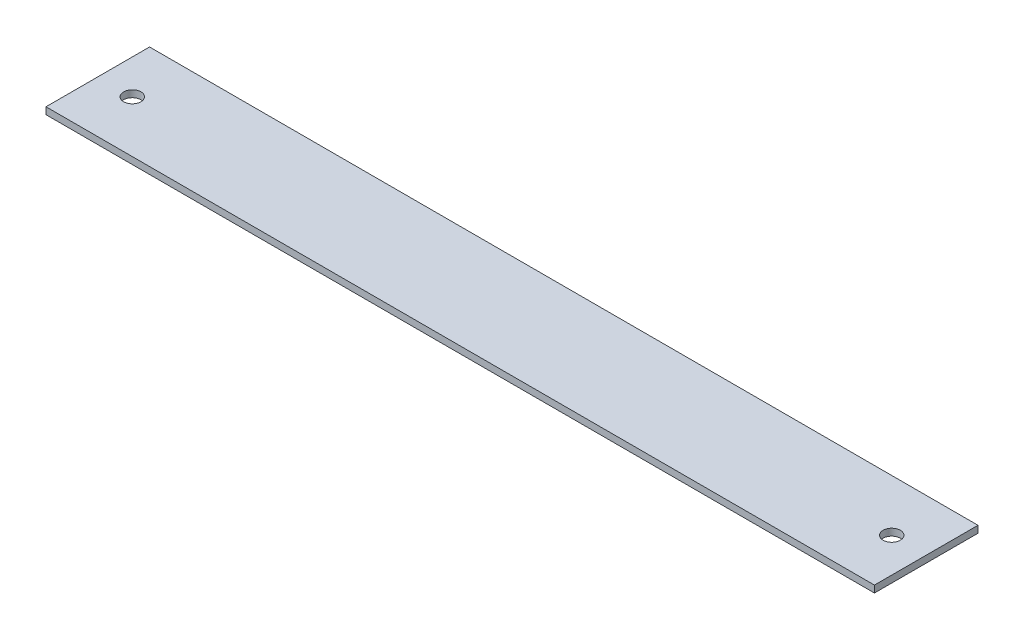
ISO-10303-21;
HEADER;
FILE_DESCRIPTION(('STEP AP214'),'2;1');
FILE_NAME('part.step','',(''),(''),'','','');
FILE_SCHEMA(('AUTOMOTIVE_DESIGN { 1 0 10303 214 1 1 1 1 }'));
ENDSEC;
DATA;
#1=APPLICATION_CONTEXT('core data for automotive mechanical design processes');
#2=APPLICATION_PROTOCOL_DEFINITION('international standard','automotive_design',2000,#1);
#3=PRODUCT_CONTEXT('',#1,'mechanical');
#4=PRODUCT('Part','Part','',(#3));
#5=PRODUCT_RELATED_PRODUCT_CATEGORY('part','',(#4));
#6=PRODUCT_DEFINITION_FORMATION('','',#4);
#7=PRODUCT_DEFINITION_CONTEXT('part definition',#1,'design');
#8=PRODUCT_DEFINITION('design','',#6,#7);
#9=PRODUCT_DEFINITION_SHAPE('','',#8);
#10=(LENGTH_UNIT() NAMED_UNIT(*) SI_UNIT(.MILLI.,.METRE.));
#11=(NAMED_UNIT(*) PLANE_ANGLE_UNIT() SI_UNIT($,.RADIAN.));
#12=(NAMED_UNIT(*) SI_UNIT($,.STERADIAN.) SOLID_ANGLE_UNIT());
#13=UNCERTAINTY_MEASURE_WITH_UNIT(LENGTH_MEASURE(1.E-05),#10,'distance_accuracy_value','');
#14=(GEOMETRIC_REPRESENTATION_CONTEXT(3) GLOBAL_UNCERTAINTY_ASSIGNED_CONTEXT((#13)) GLOBAL_UNIT_ASSIGNED_CONTEXT((#10,
#11,#12)) REPRESENTATION_CONTEXT('',''));
#15=CARTESIAN_POINT('',(0.,0.,0.));
#16=DIRECTION('',(0.,0.,1.));
#17=DIRECTION('',(1.,0.,0.));
#18=AXIS2_PLACEMENT_3D('',#15,#16,#17);
#19=CARTESIAN_POINT('',(0.,1.,0.));
#20=DIRECTION('',(1.,0.,0.));
#21=DIRECTION('',(0.,0.,-1.));
#22=AXIS2_PLACEMENT_3D('',#19,#20,#21);
#23=PLANE('',#22);
#24=DIRECTION('',(0.,0.,1.));
#25=VECTOR('',#24,1.);
#26=CARTESIAN_POINT('',(0.,0.,0.));
#27=LINE('',#26,#25);
#28=CARTESIAN_POINT('',(0.,0.,-15.));
#29=VERTEX_POINT('',#28);
#30=CARTESIAN_POINT('',(0.,0.,0.));
#31=VERTEX_POINT('',#30);
#32=EDGE_CURVE('E97',#29,#31,#27,.T.);
#33=ORIENTED_EDGE('',*,*,#32,.T.);
#34=DIRECTION('',(0.,-1.,0.));
#35=VECTOR('',#34,1.);
#36=CARTESIAN_POINT('',(0.,1.,0.));
#37=LINE('',#36,#35);
#38=CARTESIAN_POINT('',(0.,1.,0.));
#39=VERTEX_POINT('',#38);
#40=EDGE_CURVE('E11',#39,#31,#37,.T.);
#41=ORIENTED_EDGE('',*,*,#40,.F.);
#42=DIRECTION('',(0.,0.,1.));
#43=VECTOR('',#42,1.);
#44=CARTESIAN_POINT('',(0.,1.,0.));
#45=LINE('',#44,#43);
#46=CARTESIAN_POINT('',(0.,1.,-15.));
#47=VERTEX_POINT('',#46);
#48=EDGE_CURVE('E85',#47,#39,#45,.T.);
#49=ORIENTED_EDGE('',*,*,#48,.F.);
#50=DIRECTION('',(0.,-1.,0.));
#51=VECTOR('',#50,1.);
#52=CARTESIAN_POINT('',(0.,1.,-15.));
#53=LINE('',#52,#51);
#54=EDGE_CURVE('E93',#47,#29,#53,.T.);
#55=ORIENTED_EDGE('',*,*,#54,.T.);
#56=EDGE_LOOP('',(#33,#41,#49,#55));
#57=FACE_BOUND('',#56,.T.);
#58=ADVANCED_FACE('F34',(#57),#23,.F.);
#59=CARTESIAN_POINT('',(0.,1.,0.));
#60=DIRECTION('',(0.,0.,-1.));
#61=DIRECTION('',(-1.,0.,0.));
#62=AXIS2_PLACEMENT_3D('',#59,#60,#61);
#63=PLANE('',#62);
#64=DIRECTION('',(1.,0.,0.));
#65=VECTOR('',#64,1.);
#66=CARTESIAN_POINT('',(0.,0.,0.));
#67=LINE('',#66,#65);
#68=CARTESIAN_POINT('',(120.,0.,0.));
#69=VERTEX_POINT('',#68);
#70=EDGE_CURVE('E89',#31,#69,#67,.T.);
#71=ORIENTED_EDGE('',*,*,#70,.T.);
#72=DIRECTION('',(0.,-1.,0.));
#73=VECTOR('',#72,1.);
#74=CARTESIAN_POINT('',(120.,1.,0.));
#75=LINE('',#74,#73);
#76=CARTESIAN_POINT('',(120.,1.,0.));
#77=VERTEX_POINT('',#76);
#78=EDGE_CURVE('E42',#77,#69,#75,.T.);
#79=ORIENTED_EDGE('',*,*,#78,.F.);
#80=DIRECTION('',(1.,0.,0.));
#81=VECTOR('',#80,1.);
#82=CARTESIAN_POINT('',(0.,1.,0.));
#83=LINE('',#82,#81);
#84=EDGE_CURVE('E80',#39,#77,#83,.T.);
#85=ORIENTED_EDGE('',*,*,#84,.F.);
#86=ORIENTED_EDGE('',*,*,#40,.T.);
#87=EDGE_LOOP('',(#71,#79,#85,#86));
#88=FACE_BOUND('',#87,.T.);
#89=ADVANCED_FACE('F88',(#88),#63,.F.);
#90=CARTESIAN_POINT('',(120.,1.,0.));
#91=DIRECTION('',(-1.,0.,0.));
#92=DIRECTION('',(0.,0.,1.));
#93=AXIS2_PLACEMENT_3D('',#90,#91,#92);
#94=PLANE('',#93);
#95=DIRECTION('',(0.,0.,-1.));
#96=VECTOR('',#95,1.);
#97=CARTESIAN_POINT('',(120.,0.,0.));
#98=LINE('',#97,#96);
#99=CARTESIAN_POINT('',(120.,0.,-15.));
#100=VERTEX_POINT('',#99);
#101=EDGE_CURVE('E67',#69,#100,#98,.T.);
#102=ORIENTED_EDGE('',*,*,#101,.T.);
#103=DIRECTION('',(0.,-1.,0.));
#104=VECTOR('',#103,1.);
#105=CARTESIAN_POINT('',(120.,1.,-15.));
#106=LINE('',#105,#104);
#107=CARTESIAN_POINT('',(120.,1.,-15.));
#108=VERTEX_POINT('',#107);
#109=EDGE_CURVE('E90',#108,#100,#106,.T.);
#110=ORIENTED_EDGE('',*,*,#109,.F.);
#111=DIRECTION('',(0.,0.,-1.));
#112=VECTOR('',#111,1.);
#113=CARTESIAN_POINT('',(120.,1.,0.));
#114=LINE('',#113,#112);
#115=EDGE_CURVE('E83',#77,#108,#114,.T.);
#116=ORIENTED_EDGE('',*,*,#115,.F.);
#117=ORIENTED_EDGE('',*,*,#78,.T.);
#118=EDGE_LOOP('',(#102,#110,#116,#117));
#119=FACE_BOUND('',#118,.T.);
#120=ADVANCED_FACE('F91',(#119),#94,.F.);
#121=CARTESIAN_POINT('',(0.,1.,-15.));
#122=DIRECTION('',(0.,0.,1.));
#123=DIRECTION('',(1.,0.,0.));
#124=AXIS2_PLACEMENT_3D('',#121,#122,#123);
#125=PLANE('',#124);
#126=DIRECTION('',(-1.,0.,0.));
#127=VECTOR('',#126,1.);
#128=CARTESIAN_POINT('',(0.,0.,-15.));
#129=LINE('',#128,#127);
#130=EDGE_CURVE('E73',#100,#29,#129,.T.);
#131=ORIENTED_EDGE('',*,*,#130,.T.);
#132=ORIENTED_EDGE('',*,*,#54,.F.);
#133=DIRECTION('',(-1.,0.,0.));
#134=VECTOR('',#133,1.);
#135=CARTESIAN_POINT('',(0.,1.,-15.));
#136=LINE('',#135,#134);
#137=EDGE_CURVE('E50',#108,#47,#136,.T.);
#138=ORIENTED_EDGE('',*,*,#137,.F.);
#139=ORIENTED_EDGE('',*,*,#109,.T.);
#140=EDGE_LOOP('',(#131,#132,#138,#139));
#141=FACE_BOUND('',#140,.T.);
#142=ADVANCED_FACE('F105',(#141),#125,.F.);
#143=CARTESIAN_POINT('',(0.,1.,0.));
#144=DIRECTION('',(0.,-1.,0.));
#145=DIRECTION('',(0.,0.,-1.));
#146=AXIS2_PLACEMENT_3D('',#143,#144,#145);
#147=PLANE('',#146);
#148=CARTESIAN_POINT('',(5.,1.,-7.5));
#149=DIRECTION('',(0.,1.,0.));
#150=DIRECTION('',(0.,0.,1.));
#151=AXIS2_PLACEMENT_3D('',#148,#149,#150);
#152=CIRCLE('',#151,1.25);
#153=CARTESIAN_POINT('',(5.,1.,-6.25));
#154=VERTEX_POINT('',#153);
#155=EDGE_CURVE('E119',#154,#154,#152,.T.);
#156=ORIENTED_EDGE('',*,*,#155,.F.);
#157=EDGE_LOOP('',(#156));
#158=FACE_BOUND('',#157,.T.);
#159=CARTESIAN_POINT('',(115.,1.,-7.5));
#160=DIRECTION('',(0.,1.,0.));
#161=DIRECTION('',(0.,0.,1.));
#162=AXIS2_PLACEMENT_3D('',#159,#160,#161);
#163=CIRCLE('',#162,1.25);
#164=CARTESIAN_POINT('',(115.,1.,-6.25));
#165=VERTEX_POINT('',#164);
#166=EDGE_CURVE('E113',#165,#165,#163,.T.);
#167=ORIENTED_EDGE('',*,*,#166,.F.);
#168=EDGE_LOOP('',(#167));
#169=FACE_BOUND('',#168,.T.);
#170=ORIENTED_EDGE('',*,*,#48,.T.);
#171=ORIENTED_EDGE('',*,*,#84,.T.);
#172=ORIENTED_EDGE('',*,*,#115,.T.);
#173=ORIENTED_EDGE('',*,*,#137,.T.);
#174=EDGE_LOOP('',(#170,#171,#172,#173));
#175=FACE_BOUND('',#174,.T.);
#176=ADVANCED_FACE('F81',(#158,#169,#175),#147,.F.);
#177=CARTESIAN_POINT('',(0.,0.,0.));
#178=DIRECTION('',(0.,-1.,0.));
#179=DIRECTION('',(0.,0.,-1.));
#180=AXIS2_PLACEMENT_3D('',#177,#178,#179);
#181=PLANE('',#180);
#182=CARTESIAN_POINT('',(5.,0.,-7.5));
#183=DIRECTION('',(0.,1.,0.));
#184=DIRECTION('',(0.,0.,1.));
#185=AXIS2_PLACEMENT_3D('',#182,#183,#184);
#186=CIRCLE('',#185,1.25);
#187=CARTESIAN_POINT('',(5.,0.,-6.25));
#188=VERTEX_POINT('',#187);
#189=EDGE_CURVE('E116',#188,#188,#186,.T.);
#190=ORIENTED_EDGE('',*,*,#189,.T.);
#191=EDGE_LOOP('',(#190));
#192=FACE_BOUND('',#191,.T.);
#193=CARTESIAN_POINT('',(115.,0.,-7.5));
#194=DIRECTION('',(0.,1.,0.));
#195=DIRECTION('',(0.,0.,1.));
#196=AXIS2_PLACEMENT_3D('',#193,#194,#195);
#197=CIRCLE('',#196,1.25);
#198=CARTESIAN_POINT('',(115.,0.,-6.25));
#199=VERTEX_POINT('',#198);
#200=EDGE_CURVE('E100',#199,#199,#197,.T.);
#201=ORIENTED_EDGE('',*,*,#200,.T.);
#202=EDGE_LOOP('',(#201));
#203=FACE_BOUND('',#202,.T.);
#204=ORIENTED_EDGE('',*,*,#32,.F.);
#205=ORIENTED_EDGE('',*,*,#130,.F.);
#206=ORIENTED_EDGE('',*,*,#101,.F.);
#207=ORIENTED_EDGE('',*,*,#70,.F.);
#208=EDGE_LOOP('',(#204,#205,#206,#207));
#209=FACE_BOUND('',#208,.T.);
#210=ADVANCED_FACE('F108',(#192,#203,#209),#181,.T.);
#211=CARTESIAN_POINT('',(115.,1.,-7.5));
#212=DIRECTION('',(0.,1.,0.));
#213=DIRECTION('',(0.,0.,1.));
#214=AXIS2_PLACEMENT_3D('',#211,#212,#213);
#215=CYLINDRICAL_SURFACE('',#214,1.25);
#216=ORIENTED_EDGE('',*,*,#200,.F.);
#217=EDGE_LOOP('',(#216));
#218=FACE_BOUND('',#217,.T.);
#219=ORIENTED_EDGE('',*,*,#166,.T.);
#220=EDGE_LOOP('',(#219));
#221=FACE_BOUND('',#220,.T.);
#222=ADVANCED_FACE('F130',(#218,#221),#215,.F.);
#223=CARTESIAN_POINT('',(5.,1.,-7.5));
#224=DIRECTION('',(0.,1.,0.));
#225=DIRECTION('',(0.,0.,1.));
#226=AXIS2_PLACEMENT_3D('',#223,#224,#225);
#227=CYLINDRICAL_SURFACE('',#226,1.25);
#228=ORIENTED_EDGE('',*,*,#189,.F.);
#229=EDGE_LOOP('',(#228));
#230=FACE_BOUND('',#229,.T.);
#231=ORIENTED_EDGE('',*,*,#155,.T.);
#232=EDGE_LOOP('',(#231));
#233=FACE_BOUND('',#232,.T.);
#234=ADVANCED_FACE('F123',(#230,#233),#227,.F.);
#235=CLOSED_SHELL('',(#58,#89,#120,#142,#176,#210,#222,#234));
#236=MANIFOLD_SOLID_BREP('B2',#235);
#237=ADVANCED_BREP_SHAPE_REPRESENTATION('',(#18,#236),#14);
#238=SHAPE_DEFINITION_REPRESENTATION(#9,#237);
ENDSEC;
END-ISO-10303-21;
